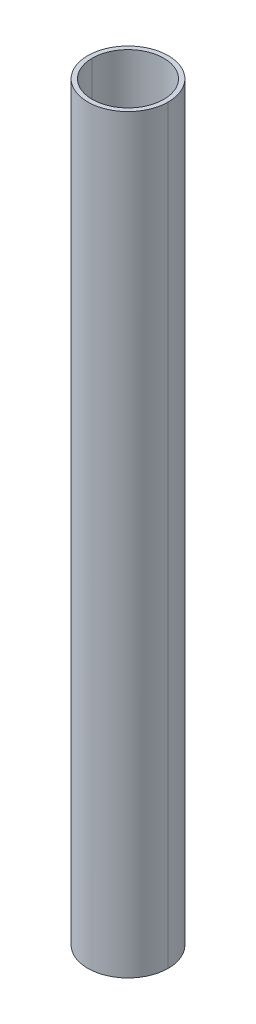
ISO-10303-21;
HEADER;
FILE_DESCRIPTION(('STEP AP214'),'2;1');
FILE_NAME('part.step','',(''),(''),'','','');
FILE_SCHEMA(('AUTOMOTIVE_DESIGN { 1 0 10303 214 1 1 1 1 }'));
ENDSEC;
DATA;
#1=APPLICATION_CONTEXT('core data for automotive mechanical design processes');
#2=APPLICATION_PROTOCOL_DEFINITION('international standard','automotive_design',2000,#1);
#3=PRODUCT_CONTEXT('',#1,'mechanical');
#4=PRODUCT('Part','Part','',(#3));
#5=PRODUCT_RELATED_PRODUCT_CATEGORY('part','',(#4));
#6=PRODUCT_DEFINITION_FORMATION('','',#4);
#7=PRODUCT_DEFINITION_CONTEXT('part definition',#1,'design');
#8=PRODUCT_DEFINITION('design','',#6,#7);
#9=PRODUCT_DEFINITION_SHAPE('','',#8);
#10=(LENGTH_UNIT() NAMED_UNIT(*) SI_UNIT(.MILLI.,.METRE.));
#11=(NAMED_UNIT(*) PLANE_ANGLE_UNIT() SI_UNIT($,.RADIAN.));
#12=(NAMED_UNIT(*) SI_UNIT($,.STERADIAN.) SOLID_ANGLE_UNIT());
#13=UNCERTAINTY_MEASURE_WITH_UNIT(LENGTH_MEASURE(1.E-05),#10,'distance_accuracy_value','');
#14=(GEOMETRIC_REPRESENTATION_CONTEXT(3) GLOBAL_UNCERTAINTY_ASSIGNED_CONTEXT((#13)) GLOBAL_UNIT_ASSIGNED_CONTEXT((#10,
#11,#12)) REPRESENTATION_CONTEXT('',''));
#15=CARTESIAN_POINT('',(0.,0.,0.));
#16=DIRECTION('',(0.,0.,1.));
#17=DIRECTION('',(1.,0.,0.));
#18=AXIS2_PLACEMENT_3D('',#15,#16,#17);
#19=CARTESIAN_POINT('',(0.0306618389229463,83.919338161077,2.22044604925031E-13));
#20=DIRECTION('',(0.,-1.,0.));
#21=DIRECTION('',(1.,0.,6.71011104790687E-12));
#22=AXIS2_PLACEMENT_3D('',#19,#20,#21);
#23=PLANE('',#22);
#24=CARTESIAN_POINT('',(0.0306618389229641,83.9193381610767,1.00431815641678E-13));
#25=DIRECTION('',(0.,-1.,0.));
#26=DIRECTION('',(-1.,0.,-6.7059150851682E-12));
#27=AXIS2_PLACEMENT_3D('',#24,#25,#26);
#28=CIRCLE('',#27,9.);
#29=CARTESIAN_POINT('',(-8.96933816107704,83.919338161077,-6.02911002300981E-11));
#30=VERTEX_POINT('',#29);
#31=CARTESIAN_POINT('',(9.03066183892296,83.919338161077,6.05726716601973E-11));
#32=VERTEX_POINT('',#31);
#33=EDGE_CURVE('E61',#30,#32,#28,.T.);
#34=ORIENTED_EDGE('',*,*,#33,.F.);
#35=CARTESIAN_POINT('',(0.0306618389229641,83.9193381610767,1.00431815641678E-13));
#36=DIRECTION('',(0.,-1.,0.));
#37=DIRECTION('',(1.,0.,6.72311209967244E-12));
#38=AXIS2_PLACEMENT_3D('',#35,#36,#37);
#39=CIRCLE('',#38,9.);
#40=EDGE_CURVE('E55',#32,#30,#39,.T.);
#41=ORIENTED_EDGE('',*,*,#40,.F.);
#42=EDGE_LOOP('',(#34,#41));
#43=FACE_BOUND('',#42,.T.);
#44=CARTESIAN_POINT('',(0.0306618389229641,83.9193381610767,1.00431815641678E-13));
#45=DIRECTION('',(0.,1.,0.));
#46=DIRECTION('',(-1.,0.,-6.71011104790687E-12));
#47=AXIS2_PLACEMENT_3D('',#44,#45,#46);
#48=CIRCLE('',#47,8.);
#49=CARTESIAN_POINT('',(-7.96933816107704,83.919338161077,-5.3580509632025E-11));
#50=VERTEX_POINT('',#49);
#51=CARTESIAN_POINT('',(8.03066183892296,83.919338161077,5.38627750286437E-11));
#52=VERTEX_POINT('',#51);
#53=EDGE_CURVE('E126',#50,#52,#48,.T.);
#54=ORIENTED_EDGE('',*,*,#53,.F.);
#55=CARTESIAN_POINT('',(0.0306618389229641,83.9193381610767,1.00431815641678E-13));
#56=DIRECTION('',(0.,1.,0.));
#57=DIRECTION('',(1.,0.,6.72311209967244E-12));
#58=AXIS2_PLACEMENT_3D('',#55,#56,#57);
#59=CIRCLE('',#58,8.);
#60=EDGE_CURVE('E85',#52,#50,#59,.T.);
#61=ORIENTED_EDGE('',*,*,#60,.F.);
#62=EDGE_LOOP('',(#54,#61));
#63=FACE_BOUND('',#62,.T.);
#64=ADVANCED_FACE('F15',(#43,#63),#23,.F.);
#65=CARTESIAN_POINT('',(0.0306618389228908,-81.0806618389233,1.11022302462516E-13));
#66=DIRECTION('',(0.,1.,0.));
#67=DIRECTION('',(-1.,0.,-6.71011104790687E-12));
#68=AXIS2_PLACEMENT_3D('',#65,#66,#67);
#69=CYLINDRICAL_SURFACE('',#68,9.);
#70=CARTESIAN_POINT('',(-8.96933816107711,-83.980661838923,-6.02420273282223E-11));
#71=DIRECTION('',(0.,1.,0.));
#72=VECTOR('',#71,1.);
#73=LINE('',#70,#72);
#74=CARTESIAN_POINT('',(-8.96933816107716,-83.980661838923,-6.02799243727132E-11));
#75=VERTEX_POINT('',#74);
#76=EDGE_CURVE('E78',#75,#30,#73,.T.);
#77=ORIENTED_EDGE('',*,*,#76,.F.);
#78=CARTESIAN_POINT('',(9.03066183892274,-83.980661838923,6.03909994311618E-11));
#79=CARTESIAN_POINT('',(9.03066183891679,-83.980661838923,0.886144877285532));
#80=CARTESIAN_POINT('',(8.85772936254004,-83.980661838923,1.75581289820438));
#81=CARTESIAN_POINT('',(8.68495728292758,-83.980661838923,2.62467429251675));
#82=CARTESIAN_POINT('',(8.34557763150122,-83.980661838923,3.44415089134159));
#83=CARTESIAN_POINT('',(8.0066188697484,-83.980661838923,4.26261119694819));
#84=CARTESIAN_POINT('',(7.51388834961211,-83.980661838923,5.00013209722661));
#85=CARTESIAN_POINT('',(7.02176890084166,-83.980661838923,5.73673834358073));
#86=CARTESIAN_POINT('',(6.39462286955899,-83.980661838923,6.36396103072161));
#87=CARTESIAN_POINT('',(5.76825460820442,-83.980661838923,6.99040585286781));
#88=CARTESIAN_POINT('',(5.03079393604898,-83.980661838923,7.48322651075644));
#89=CARTESIAN_POINT('',(4.29424784312256,-83.980661838923,7.97543598549408));
#90=CARTESIAN_POINT('',(3.47481273015279,-83.980661838923,8.31491579262468));
#91=CARTESIAN_POINT('',(2.65639385894035,-83.980661838923,8.65397458587594));
#92=CARTESIAN_POINT('',(1.78647473700871,-83.980661838923,8.82706752364085));
#93=CARTESIAN_POINT('',(0.917634465762084,-83.980661838923,8.99994579612277));
#94=CARTESIAN_POINT('',(0.0306618388624044,-83.980661838923,9.));
#95=CARTESIAN_POINT('',(-0.85521078803895,-83.980661838923,9.00005413665502));
#96=CARTESIAN_POINT('',(-1.72515105928159,-83.980661838923,8.82706752361731));
#97=CARTESIAN_POINT('',(-2.59401245360079,-83.980661838923,8.65429544400337));
#98=CARTESIAN_POINT('',(-3.4134890524188,-83.980661838923,8.3149157925785));
#99=CARTESIAN_POINT('',(-4.23194935803164,-83.980661838923,7.97595703082175));
#100=CARTESIAN_POINT('',(-4.96947025830384,-83.980661838923,7.4832265106894));
#101=CARTESIAN_POINT('',(-5.70607650466077,-83.980661838923,6.99110706191684));
#102=CARTESIAN_POINT('',(-6.33329919179883,-83.980661838923,6.36396103063629));
#103=CARTESIAN_POINT('',(-6.95974401394791,-83.980661838923,5.73759276927814));
#104=CARTESIAN_POINT('',(-7.45256467183367,-83.980661838923,5.00013209712629));
#105=CARTESIAN_POINT('',(-7.94477414657212,-83.980661838923,4.26358600419793));
#106=CARTESIAN_POINT('',(-8.28425395370191,-83.980661838923,3.44415089123011));
#107=CARTESIAN_POINT('',(-8.62331274695051,-83.980661838923,2.62573202002411));
#108=CARTESIAN_POINT('',(-8.7964056847181,-83.980661838923,1.75581289808603));
#109=CARTESIAN_POINT('',(-8.96933816108321,-83.980661838923,0.886700212529145));
#110=CARTESIAN_POINT('',(-8.96933816107726,-83.980661838923,-6.02779867681604E-11));
#111=B_SPLINE_CURVE_WITH_KNOTS('',2,(#78,#79,#80,#81,#82,#83,#84,#85,#86,#87,#88,#89,#90,#91,
#92,#93,#94,#95,#96,#97,#98,#99,#100,#101,#102,#103,#104,#105,#106,#107,#108,#109,#110),
.UNSPECIFIED.,.F.,.F.,(3,2,2,2,2,2,2,2,2,2,2,2,2,2,2,2,3),(0.,0.0625,0.125,0.1875,0.25,0.3125,
0.375,0.4375,0.5,0.5625,0.625,0.6875,0.75,0.8125,0.875,0.9375,1.),.UNSPECIFIED.);
#112=CARTESIAN_POINT('',(9.03066183892284,-83.980661838923,6.04285696844749E-11));
#113=VERTEX_POINT('',#112);
#114=EDGE_CURVE('E71',#113,#75,#111,.T.);
#115=ORIENTED_EDGE('',*,*,#114,.F.);
#116=CARTESIAN_POINT('',(9.03066183892296,83.9193381610767,6.04725494144795E-11));
#117=DIRECTION('',(0.,-1.,0.));
#118=VECTOR('',#117,1.);
#119=LINE('',#116,#118);
#120=EDGE_CURVE('E65',#32,#113,#119,.T.);
#121=ORIENTED_EDGE('',*,*,#120,.F.);
#122=ORIENTED_EDGE('',*,*,#40,.T.);
#123=EDGE_LOOP('',(#77,#115,#121,#122));
#124=FACE_BOUND('',#123,.T.);
#125=ADVANCED_FACE('F69',(#124),#69,.T.);
#126=CARTESIAN_POINT('',(0.0306618389228908,-81.0806618389233,1.11022302462516E-13));
#127=DIRECTION('',(0.,1.,0.));
#128=DIRECTION('',(-1.,0.,-6.71011104790687E-12));
#129=AXIS2_PLACEMENT_3D('',#126,#127,#128);
#130=CYLINDRICAL_SURFACE('',#129,9.);
#131=ORIENTED_EDGE('',*,*,#76,.T.);
#132=ORIENTED_EDGE('',*,*,#33,.T.);
#133=ORIENTED_EDGE('',*,*,#120,.T.);
#134=CARTESIAN_POINT('',(-8.96933816107726,-83.980661838923,-6.02779867681604E-11));
#135=CARTESIAN_POINT('',(-8.96933816107131,-83.980661838923,-0.886144877293301));
#136=CARTESIAN_POINT('',(-8.79640568469458,-83.980661838923,-1.75581289820428));
#137=CARTESIAN_POINT('',(-8.62363360507931,-83.980661838923,-2.62467429252302));
#138=CARTESIAN_POINT('',(-8.28425395365577,-83.980661838923,-3.44415089134151));
#139=CARTESIAN_POINT('',(-7.94529519190307,-83.980661838923,-4.2626111969483));
#140=CARTESIAN_POINT('',(-7.45256467176667,-83.980661838923,-5.00013209722655));
#141=CARTESIAN_POINT('',(-6.96044522299269,-83.980661838923,-5.73673834358562));
#142=CARTESIAN_POINT('',(-6.33329919171355,-83.980661838923,-6.36396103072157));
#143=CARTESIAN_POINT('',(-5.706930930354,-83.980661838923,-6.99040585287136));
#144=CARTESIAN_POINT('',(-4.96947025820354,-83.980661838923,-7.48322651075641));
#145=CARTESIAN_POINT('',(-4.23292416527611,-83.980661838923,-7.97543598549449));
#146=CARTESIAN_POINT('',(-3.41348905230734,-83.980661838923,-8.31491579262467));
#147=CARTESIAN_POINT('',(-2.59507018110137,-83.980661838923,-8.65397458587325));
#148=CARTESIAN_POINT('',(-1.72515105916325,-83.980661838923,-8.82706752364085));
#149=CARTESIAN_POINT('',(-0.85631078792364,-83.980661838923,-8.99994579612277));
#150=CARTESIAN_POINT('',(0.0306618389830718,-83.980661838923,-9.));
#151=CARTESIAN_POINT('',(0.916534465891456,-83.980661838923,-9.00005413665502));
#152=CARTESIAN_POINT('',(1.78647473712707,-83.980661838923,-8.82706752361731));
#153=CARTESIAN_POINT('',(2.65533613144627,-83.980661838923,-8.65429544400198));
#154=CARTESIAN_POINT('',(3.4748127302643,-83.980661838923,-8.31491579257849));
#155=CARTESIAN_POINT('',(4.29327303586702,-83.980661838923,-7.97595703082733));
#156=CARTESIAN_POINT('',(5.03079393614934,-83.980661838923,-7.48322651068938));
#157=CARTESIAN_POINT('',(5.76740018250274,-83.980661838923,-6.99110706192035));
#158=CARTESIAN_POINT('',(6.39462286964435,-83.980661838923,-6.36396103063625));
#159=CARTESIAN_POINT('',(7.02106769179198,-83.980661838923,-5.73759276927955));
#160=CARTESIAN_POINT('',(7.51388834967919,-83.980661838923,-5.00013209712622));
#161=CARTESIAN_POINT('',(8.00609782441646,-83.980661838923,-4.26358600420034));
#162=CARTESIAN_POINT('',(8.34557763154743,-83.980661838923,-3.44415089123003));
#163=CARTESIAN_POINT('',(8.68463642479586,-83.980661838923,-2.62573202002478));
#164=CARTESIAN_POINT('',(8.85772936256359,-83.980661838923,-1.75581289808593));
#165=CARTESIAN_POINT('',(9.03066183892869,-83.980661838923,-0.886700212529148));
#166=CARTESIAN_POINT('',(9.03066183892274,-83.980661838923,6.03909994311618E-11));
#167=B_SPLINE_CURVE_WITH_KNOTS('',2,(#134,#135,#136,#137,#138,#139,#140,#141,#142,#143,#144,
#145,#146,#147,#148,#149,#150,#151,#152,#153,#154,#155,#156,#157,#158,#159,#160,#161,#162,#163,
#164,#165,#166),.UNSPECIFIED.,.F.,.F.,(3,2,2,2,2,2,2,2,2,2,2,2,2,2,2,2,3),(0.,0.0625,0.125,
0.1875,0.25,0.3125,0.375,0.4375,0.5,0.5625,0.625,0.6875,0.75,0.8125,0.875,0.9375,1.),.UNSPECIFIED.);
#168=EDGE_CURVE('E119',#75,#113,#167,.T.);
#169=ORIENTED_EDGE('',*,*,#168,.F.);
#170=EDGE_LOOP('',(#131,#132,#133,#169));
#171=FACE_BOUND('',#170,.T.);
#172=ADVANCED_FACE('F82',(#171),#130,.T.);
#173=CARTESIAN_POINT('',(0.0306618389228908,-81.0806618389233,1.11022302462516E-13));
#174=DIRECTION('',(0.,1.,0.));
#175=DIRECTION('',(-1.,0.,-6.71011104790687E-12));
#176=AXIS2_PLACEMENT_3D('',#173,#174,#175);
#177=CYLINDRICAL_SURFACE('',#176,8.);
#178=CARTESIAN_POINT('',(-7.96933816107711,-83.980661838923,-5.35361122430541E-11));
#179=DIRECTION('',(0.,1.,0.));
#180=VECTOR('',#179,1.);
#181=LINE('',#178,#180);
#182=CARTESIAN_POINT('',(-7.96933816107716,-83.980661838923,-5.35710177671523E-11));
#183=VERTEX_POINT('',#182);
#184=EDGE_CURVE('E35',#183,#50,#181,.T.);
#185=ORIENTED_EDGE('',*,*,#184,.F.);
#186=CARTESIAN_POINT('',(8.03066183892274,-83.980661838923,5.3680888383255E-11));
#187=CARTESIAN_POINT('',(8.03066183892802,-83.980661838923,-0.787653463142129));
#188=CARTESIAN_POINT('',(7.87694408215905,-83.980661838923,-1.56072257607639));
#189=CARTESIAN_POINT('',(7.72338671811405,-83.980661838923,-2.33298505051004));
#190=CARTESIAN_POINT('',(7.42169809903357,-83.980661838923,-3.06146745887114));
#191=CARTESIAN_POINT('',(7.12043036185952,-83.980661838923,-3.78893357080792));
#192=CARTESIAN_POINT('',(6.68241873737291,-83.980661838923,-4.4445618641122));
#193=CARTESIAN_POINT('',(6.24501817725822,-83.980661838923,-5.0992754988347));
#194=CARTESIAN_POINT('',(5.68751608845306,-83.980661838923,-5.65685424945444));
#195=CARTESIAN_POINT('',(5.13079176362534,-83.980661838923,-6.21365512914683));
#196=CARTESIAN_POINT('',(4.47522370312416,-83.980661838923,-6.65175689839056));
#197=CARTESIAN_POINT('',(3.82057021717547,-83.980661838923,-7.08924747750211));
#198=CARTESIAN_POINT('',(3.09212929789301,-83.980661838923,-7.39103626006977));
#199=CARTESIAN_POINT('',(2.36470461715463,-83.980661838923,-7.69240402099394));
#200=CARTESIAN_POINT('',(1.59138441510437,-83.980661838923,-7.84628224321538));
#201=CARTESIAN_POINT('',(0.819143062107691,-83.980661838923,-7.99994579191094));
#202=CARTESIAN_POINT('',(0.0306618389763636,-83.980661838923,-8.));
#203=CARTESIAN_POINT('',(-0.756719384163873,-83.980661838923,-8.00005413246405));
#204=CARTESIAN_POINT('',(-1.5300607371537,-83.980661838923,-7.8462822432363));
#205=CARTESIAN_POINT('',(-2.30232321159559,-83.980661838923,-7.69272487918805));
#206=CARTESIAN_POINT('',(-3.03080561994845,-83.980661838923,-7.39103626011081));
#207=CARTESIAN_POINT('',(-3.75827173188586,-83.980661838923,-7.08976852293632));
#208=CARTESIAN_POINT('',(-4.41390002518951,-83.980661838923,-6.65175689845014));
#209=CARTESIAN_POINT('',(-5.06861365991383,-83.980661838923,-6.21435633833424));
#210=CARTESIAN_POINT('',(-5.62619241053174,-83.980661838923,-5.65685424953028));
#211=CARTESIAN_POINT('',(-6.18299329022409,-83.980661838923,-5.10012992470197));
#212=CARTESIAN_POINT('',(-6.62109505946785,-83.980661838923,-4.44456186420138));
#213=CARTESIAN_POINT('',(-7.05858563857903,-83.980661838923,-3.78990837825386));
#214=CARTESIAN_POINT('',(-7.36037442114705,-83.980661838923,-3.06146745897022));
#215=CARTESIAN_POINT('',(-7.66174218207132,-83.980661838923,-2.3340427782313));
#216=CARTESIAN_POINT('',(-7.81562040429265,-83.980661838923,-1.56072257618157));
#217=CARTESIAN_POINT('',(-7.96933816107197,-83.980661838923,-0.788208798629402));
#218=CARTESIAN_POINT('',(-7.96933816107726,-83.980661838923,-5.35717339766515E-11));
#219=B_SPLINE_CURVE_WITH_KNOTS('',2,(#186,#187,#188,#189,#190,#191,#192,#193,#194,#195,#196,
#197,#198,#199,#200,#201,#202,#203,#204,#205,#206,#207,#208,#209,#210,#211,#212,#213,#214,#215,
#216,#217,#218),.UNSPECIFIED.,.F.,.F.,(3,2,2,2,2,2,2,2,2,2,2,2,2,2,2,2,3),(0.,0.0625,0.125,
0.1875,0.25,0.3125,0.375,0.4375,0.5,0.5625,0.625,0.6875,0.75,0.8125,0.875,0.9375,1.),.UNSPECIFIED.);
#220=CARTESIAN_POINT('',(8.03066183892284,-83.980661838923,5.37189691123945E-11));
#221=VERTEX_POINT('',#220);
#222=EDGE_CURVE('E27',#221,#183,#219,.T.);
#223=ORIENTED_EDGE('',*,*,#222,.F.);
#224=CARTESIAN_POINT('',(8.03066183892296,83.9193381610767,5.3764536347942E-11));
#225=DIRECTION('',(0.,-1.,0.));
#226=VECTOR('',#225,1.);
#227=LINE('',#224,#226);
#228=EDGE_CURVE('E172',#52,#221,#227,.T.);
#229=ORIENTED_EDGE('',*,*,#228,.F.);
#230=ORIENTED_EDGE('',*,*,#60,.T.);
#231=EDGE_LOOP('',(#185,#223,#229,#230));
#232=FACE_BOUND('',#231,.T.);
#233=ADVANCED_FACE('F100',(#232),#177,.F.);
#234=CARTESIAN_POINT('',(0.0306618389228908,-81.0806618389233,1.11022302462516E-13));
#235=DIRECTION('',(0.,1.,0.));
#236=DIRECTION('',(-1.,0.,-6.71011104790687E-12));
#237=AXIS2_PLACEMENT_3D('',#234,#235,#236);
#238=CYLINDRICAL_SURFACE('',#237,8.);
#239=ORIENTED_EDGE('',*,*,#184,.T.);
#240=ORIENTED_EDGE('',*,*,#53,.T.);
#241=ORIENTED_EDGE('',*,*,#228,.T.);
#242=CARTESIAN_POINT('',(-7.96933816107726,-83.980661838923,-5.35717339766515E-11));
#243=CARTESIAN_POINT('',(-7.96933816108255,-83.980661838923,0.787653463143988));
#244=CARTESIAN_POINT('',(-7.81562040431356,-83.980661838923,1.56072257607648));
#245=CARTESIAN_POINT('',(-7.66206304026782,-83.980661838923,2.33298505051196));
#246=CARTESIAN_POINT('',(-7.36037442118807,-83.980661838923,3.06146745887121));
#247=CARTESIAN_POINT('',(-7.05910668401393,-83.980661838923,3.78893357080809));
#248=CARTESIAN_POINT('',(-6.62109505952739,-83.980661838923,4.44456186411226));
#249=CARTESIAN_POINT('',(-6.183694499414,-83.980661838923,5.09927549883283));
#250=CARTESIAN_POINT('',(-5.62619241060754,-83.980661838923,5.65685424945448));
#251=CARTESIAN_POINT('',(-5.06946808578287,-83.980661838923,6.21365512914445));
#252=CARTESIAN_POINT('',(-4.41390002527866,-83.980661838923,6.65175689839058));
#253=CARTESIAN_POINT('',(-3.75924653933345,-83.980661838923,7.08924747750018));
#254=CARTESIAN_POINT('',(-3.03080562004751,-83.980661838923,7.39103626006978));
#255=CARTESIAN_POINT('',(-2.30338093930902,-83.980661838923,7.6924040209945));
#256=CARTESIAN_POINT('',(-1.53006073725888,-83.980661838923,7.84628224321539));
#257=CARTESIAN_POINT('',(-0.757819384259532,-83.980661838923,7.99994579191094));
#258=CARTESIAN_POINT('',(0.0306618388691126,-83.980661838923,8.));
#259=CARTESIAN_POINT('',(0.81804306200686,-83.980661838923,8.00005413246405));
#260=CARTESIAN_POINT('',(1.59138441499916,-83.980661838923,7.8462822432363));
#261=CARTESIAN_POINT('',(2.36364688943475,-83.980661838923,7.6927248791898));
#262=CARTESIAN_POINT('',(3.0921292977939,-83.980661838923,7.39103626011082));
#263=CARTESIAN_POINT('',(3.81959540972453,-83.980661838923,7.08976852294));
#264=CARTESIAN_POINT('',(4.47522370303495,-83.980661838923,6.65175689845016));
#265=CARTESIAN_POINT('',(5.1299373377511,-83.980661838923,6.21435633834059));
#266=CARTESIAN_POINT('',(5.68751608837718,-83.980661838923,5.65685424953032));
#267=CARTESIAN_POINT('',(6.24431696806469,-83.980661838923,5.10012992470872));
#268=CARTESIAN_POINT('',(6.68241873731329,-83.980661838923,4.44456186420144));
#269=CARTESIAN_POINT('',(7.11990931642422,-83.980661838923,3.78990837825486));
#270=CARTESIAN_POINT('',(7.4216980989925,-83.980661838923,3.0614674589703));
#271=CARTESIAN_POINT('',(7.72306585991793,-83.980661838923,2.33404277822828));
#272=CARTESIAN_POINT('',(7.87694408213812,-83.980661838923,1.56072257618167));
#273=CARTESIAN_POINT('',(8.03066183891745,-83.980661838923,0.788208798626736));
#274=CARTESIAN_POINT('',(8.03066183892274,-83.980661838923,5.3680888383255E-11));
#275=B_SPLINE_CURVE_WITH_KNOTS('',2,(#242,#243,#244,#245,#246,#247,#248,#249,#250,#251,#252,
#253,#254,#255,#256,#257,#258,#259,#260,#261,#262,#263,#264,#265,#266,#267,#268,#269,#270,#271,
#272,#273,#274),.UNSPECIFIED.,.F.,.F.,(3,2,2,2,2,2,2,2,2,2,2,2,2,2,2,2,3),(0.,0.0625,0.125,
0.1875,0.25,0.3125,0.375,0.4375,0.5,0.5625,0.625,0.6875,0.75,0.8125,0.875,0.9375,1.),.UNSPECIFIED.);
#276=EDGE_CURVE('E9',#183,#221,#275,.T.);
#277=ORIENTED_EDGE('',*,*,#276,.F.);
#278=EDGE_LOOP('',(#239,#240,#241,#277));
#279=FACE_BOUND('',#278,.T.);
#280=ADVANCED_FACE('F139',(#279),#238,.F.);
#281=CARTESIAN_POINT('',(0.0306618389227381,-83.980661838923,0.));
#282=DIRECTION('',(0.,-1.,0.));
#283=DIRECTION('',(1.,0.,6.71011104790687E-12));
#284=AXIS2_PLACEMENT_3D('',#281,#282,#283);
#285=PLANE('',#284);
#286=ORIENTED_EDGE('',*,*,#222,.T.);
#287=ORIENTED_EDGE('',*,*,#276,.T.);
#288=EDGE_LOOP('',(#286,#287));
#289=FACE_BOUND('',#288,.T.);
#290=ORIENTED_EDGE('',*,*,#114,.T.);
#291=ORIENTED_EDGE('',*,*,#168,.T.);
#292=EDGE_LOOP('',(#290,#291));
#293=FACE_BOUND('',#292,.T.);
#294=ADVANCED_FACE('F124',(#289,#293),#285,.T.);
#295=CLOSED_SHELL('',(#64,#125,#172,#233,#280,#294));
#296=MANIFOLD_SOLID_BREP('B1',#295);
#297=ADVANCED_BREP_SHAPE_REPRESENTATION('',(#18,#296),#14);
#298=SHAPE_DEFINITION_REPRESENTATION(#9,#297);
ENDSEC;
END-ISO-10303-21;
